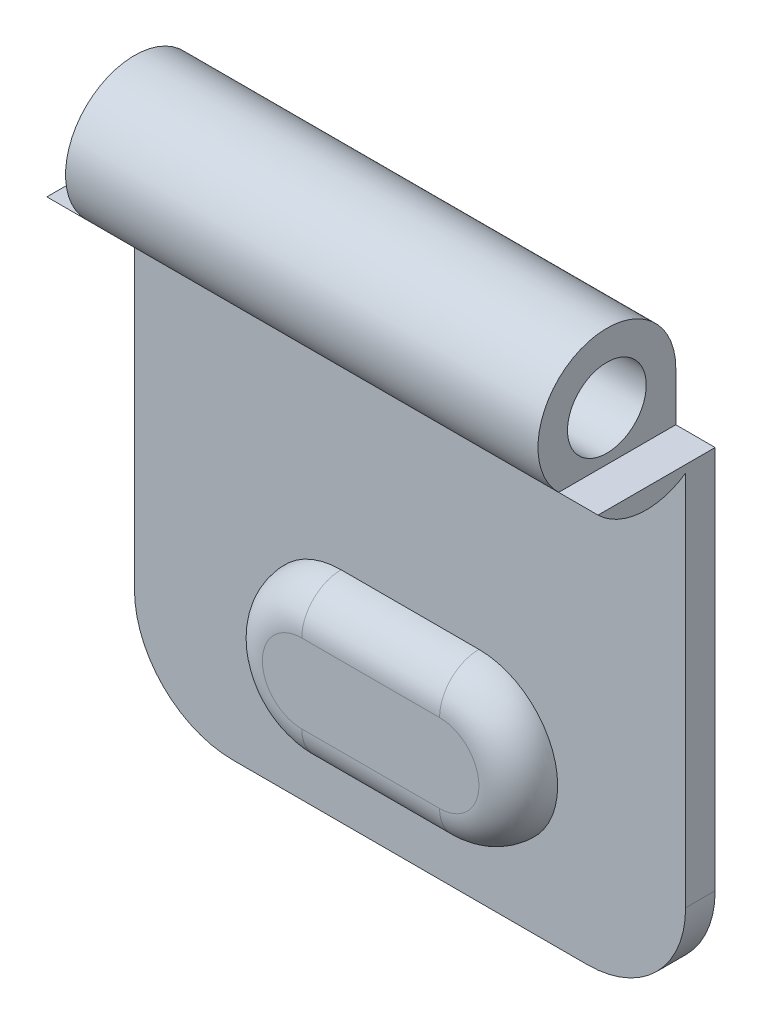
ISO-10303-21;
HEADER;
FILE_DESCRIPTION(('STEP AP214'),'2;1');
FILE_NAME('part.step','',(''),(''),'','','');
FILE_SCHEMA(('AUTOMOTIVE_DESIGN { 1 0 10303 214 1 1 1 1 }'));
ENDSEC;
DATA;
#1=APPLICATION_CONTEXT('core data for automotive mechanical design processes');
#2=APPLICATION_PROTOCOL_DEFINITION('international standard','automotive_design',2000,#1);
#3=PRODUCT_CONTEXT('',#1,'mechanical');
#4=PRODUCT('Part','Part','',(#3));
#5=PRODUCT_RELATED_PRODUCT_CATEGORY('part','',(#4));
#6=PRODUCT_DEFINITION_FORMATION('','',#4);
#7=PRODUCT_DEFINITION_CONTEXT('part definition',#1,'design');
#8=PRODUCT_DEFINITION('design','',#6,#7);
#9=PRODUCT_DEFINITION_SHAPE('','',#8);
#10=(LENGTH_UNIT() NAMED_UNIT(*) SI_UNIT(.MILLI.,.METRE.));
#11=(NAMED_UNIT(*) PLANE_ANGLE_UNIT() SI_UNIT($,.RADIAN.));
#12=(NAMED_UNIT(*) SI_UNIT($,.STERADIAN.) SOLID_ANGLE_UNIT());
#13=UNCERTAINTY_MEASURE_WITH_UNIT(LENGTH_MEASURE(1.E-05),#10,'distance_accuracy_value','');
#14=(GEOMETRIC_REPRESENTATION_CONTEXT(3) GLOBAL_UNCERTAINTY_ASSIGNED_CONTEXT((#13)) GLOBAL_UNIT_ASSIGNED_CONTEXT((#10,
#11,#12)) REPRESENTATION_CONTEXT('',''));
#15=CARTESIAN_POINT('',(0.,0.,0.));
#16=DIRECTION('',(0.,0.,1.));
#17=DIRECTION('',(1.,0.,0.));
#18=AXIS2_PLACEMENT_3D('',#15,#16,#17);
#19=CARTESIAN_POINT('',(-14.,-2.87228132326901,-2.));
#20=DIRECTION('',(0.,0.,1.));
#21=DIRECTION('',(0.,-1.,0.));
#22=AXIS2_PLACEMENT_3D('',#19,#20,#21);
#23=PLANE('',#22);
#24=DIRECTION('',(0.,-1.,0.));
#25=VECTOR('',#24,1.);
#26=CARTESIAN_POINT('',(-14.,-2.87228132326901,-2.));
#27=LINE('',#26,#25);
#28=CARTESIAN_POINT('',(-14.,-2.87228132326901,-2.));
#29=VERTEX_POINT('',#28);
#30=CARTESIAN_POINT('',(-14.,-22.,-2.));
#31=VERTEX_POINT('',#30);
#32=EDGE_CURVE('E235',#29,#31,#27,.T.);
#33=ORIENTED_EDGE('',*,*,#32,.T.);
#34=CARTESIAN_POINT('',(-9.,-22.,-2.));
#35=DIRECTION('',(0.,0.,1.));
#36=DIRECTION('',(0.,-1.,0.));
#37=AXIS2_PLACEMENT_3D('',#34,#35,#36);
#38=CIRCLE('',#37,5.);
#39=CARTESIAN_POINT('',(-9.,-27.,-2.));
#40=VERTEX_POINT('',#39);
#41=EDGE_CURVE('E263',#31,#40,#38,.T.);
#42=ORIENTED_EDGE('',*,*,#41,.T.);
#43=DIRECTION('',(1.,0.,0.));
#44=VECTOR('',#43,1.);
#45=CARTESIAN_POINT('',(-14.,-27.,-2.));
#46=LINE('',#45,#44);
#47=CARTESIAN_POINT('',(9.,-27.,-2.));
#48=VERTEX_POINT('',#47);
#49=EDGE_CURVE('E246',#40,#48,#46,.T.);
#50=ORIENTED_EDGE('',*,*,#49,.T.);
#51=CARTESIAN_POINT('',(9.,-22.,-2.));
#52=DIRECTION('',(0.,0.,1.));
#53=DIRECTION('',(0.,-1.,0.));
#54=AXIS2_PLACEMENT_3D('',#51,#52,#53);
#55=CIRCLE('',#54,5.);
#56=CARTESIAN_POINT('',(14.,-22.,-2.));
#57=VERTEX_POINT('',#56);
#58=EDGE_CURVE('E261',#48,#57,#55,.T.);
#59=ORIENTED_EDGE('',*,*,#58,.T.);
#60=DIRECTION('',(0.,-1.,0.));
#61=VECTOR('',#60,1.);
#62=CARTESIAN_POINT('',(14.,-2.87228132326901,-2.));
#63=LINE('',#62,#61);
#64=CARTESIAN_POINT('',(14.,-2.87228132326901,-2.));
#65=VERTEX_POINT('',#64);
#66=EDGE_CURVE('E227',#65,#57,#63,.T.);
#67=ORIENTED_EDGE('',*,*,#66,.F.);
#68=DIRECTION('',(1.,0.,0.));
#69=VECTOR('',#68,1.);
#70=CARTESIAN_POINT('',(-14.,-2.87228132326901,-2.));
#71=LINE('',#70,#69);
#72=EDGE_CURVE('E239',#29,#65,#71,.T.);
#73=ORIENTED_EDGE('',*,*,#72,.F.);
#74=EDGE_LOOP('',(#33,#42,#50,#59,#67,#73));
#75=FACE_BOUND('',#74,.T.);
#76=DIRECTION('',(1.,0.,0.));
#77=VECTOR('',#76,1.);
#78=CARTESIAN_POINT('',(-3.5,-23.881230086898,-2.));
#79=LINE('',#78,#77);
#80=CARTESIAN_POINT('',(-3.5,-23.881230086898,-2.));
#81=VERTEX_POINT('',#80);
#82=CARTESIAN_POINT('',(3.5,-23.881230086898,-2.));
#83=VERTEX_POINT('',#82);
#84=EDGE_CURVE('E215',#81,#83,#79,.T.);
#85=ORIENTED_EDGE('',*,*,#84,.F.);
#86=CARTESIAN_POINT('',(-3.5,-19.881230086898,-2.));
#87=DIRECTION('',(0.,0.,1.));
#88=DIRECTION('',(1.,0.,0.));
#89=AXIS2_PLACEMENT_3D('',#86,#87,#88);
#90=CIRCLE('',#89,4.);
#91=CARTESIAN_POINT('',(-3.5,-15.881230086898,-2.));
#92=VERTEX_POINT('',#91);
#93=EDGE_CURVE('E212',#92,#81,#90,.T.);
#94=ORIENTED_EDGE('',*,*,#93,.F.);
#95=DIRECTION('',(-1.,0.,0.));
#96=VECTOR('',#95,1.);
#97=CARTESIAN_POINT('',(-3.5,-15.881230086898,-2.));
#98=LINE('',#97,#96);
#99=CARTESIAN_POINT('',(3.5,-15.881230086898,-2.));
#100=VERTEX_POINT('',#99);
#101=EDGE_CURVE('E222',#100,#92,#98,.T.);
#102=ORIENTED_EDGE('',*,*,#101,.F.);
#103=CARTESIAN_POINT('',(3.5,-19.881230086898,-2.));
#104=DIRECTION('',(0.,0.,1.));
#105=DIRECTION('',(1.,0.,0.));
#106=AXIS2_PLACEMENT_3D('',#103,#104,#105);
#107=CIRCLE('',#106,4.);
#108=EDGE_CURVE('E219',#83,#100,#107,.T.);
#109=ORIENTED_EDGE('',*,*,#108,.F.);
#110=EDGE_LOOP('',(#85,#94,#102,#109));
#111=FACE_BOUND('',#110,.T.);
#112=ADVANCED_FACE('F35',(#75,#111),#23,.T.);
#113=CARTESIAN_POINT('',(-14.,0.,0.));
#114=DIRECTION('',(1.,0.,0.));
#115=DIRECTION('',(0.,0.,-1.));
#116=AXIS2_PLACEMENT_3D('',#113,#114,#115);
#117=CYLINDRICAL_SURFACE('',#116,3.5);
#118=DIRECTION('',(1.,0.,0.));
#119=VECTOR('',#118,1.);
#120=CARTESIAN_POINT('',(-14.,-2.5,2.44948974278318));
#121=LINE('',#120,#119);
#122=CARTESIAN_POINT('',(-14.,-2.5,2.44948974278318));
#123=VERTEX_POINT('',#122);
#124=CARTESIAN_POINT('',(-12.,-2.5,2.44948974278318));
#125=VERTEX_POINT('',#124);
#126=EDGE_CURVE('E176',#123,#125,#121,.T.);
#127=ORIENTED_EDGE('',*,*,#126,.F.);
#128=CARTESIAN_POINT('',(-14.,0.,0.));
#129=DIRECTION('',(1.,0.,0.));
#130=DIRECTION('',(0.,0.,-1.));
#131=AXIS2_PLACEMENT_3D('',#128,#129,#130);
#132=CIRCLE('',#131,3.5);
#133=EDGE_CURVE('E233',#123,#29,#132,.T.);
#134=ORIENTED_EDGE('',*,*,#133,.T.);
#135=ORIENTED_EDGE('',*,*,#72,.T.);
#136=CARTESIAN_POINT('',(14.,0.,0.));
#137=DIRECTION('',(1.,0.,0.));
#138=DIRECTION('',(0.,0.,-1.));
#139=AXIS2_PLACEMENT_3D('',#136,#137,#138);
#140=CIRCLE('',#139,3.5);
#141=CARTESIAN_POINT('',(14.,-2.5,2.44948974278318));
#142=VERTEX_POINT('',#141);
#143=EDGE_CURVE('E225',#142,#65,#140,.T.);
#144=ORIENTED_EDGE('',*,*,#143,.F.);
#145=DIRECTION('',(1.,0.,0.));
#146=VECTOR('',#145,1.);
#147=CARTESIAN_POINT('',(-14.,-2.5,2.44948974278318));
#148=LINE('',#147,#146);
#149=CARTESIAN_POINT('',(12.,-2.5,2.44948974278318));
#150=VERTEX_POINT('',#149);
#151=EDGE_CURVE('E59',#150,#142,#148,.T.);
#152=ORIENTED_EDGE('',*,*,#151,.F.);
#153=CARTESIAN_POINT('',(12.,0.,0.));
#154=DIRECTION('',(-1.,0.,0.));
#155=DIRECTION('',(0.,0.,1.));
#156=AXIS2_PLACEMENT_3D('',#153,#154,#155);
#157=CIRCLE('',#156,3.5);
#158=CARTESIAN_POINT('',(12.,0.,-3.5));
#159=VERTEX_POINT('',#158);
#160=EDGE_CURVE('E209',#159,#150,#157,.F.);
#161=ORIENTED_EDGE('',*,*,#160,.F.);
#162=DIRECTION('',(1.,0.,0.));
#163=VECTOR('',#162,1.);
#164=CARTESIAN_POINT('',(-14.,0.,-3.5));
#165=LINE('',#164,#163);
#166=CARTESIAN_POINT('',(-12.,0.,-3.5));
#167=VERTEX_POINT('',#166);
#168=EDGE_CURVE('E240',#167,#159,#165,.T.);
#169=ORIENTED_EDGE('',*,*,#168,.F.);
#170=CARTESIAN_POINT('',(-12.,0.,0.));
#171=DIRECTION('',(1.,0.,0.));
#172=DIRECTION('',(0.,0.,-1.));
#173=AXIS2_PLACEMENT_3D('',#170,#171,#172);
#174=CIRCLE('',#173,3.5);
#175=EDGE_CURVE('E185',#125,#167,#174,.F.);
#176=ORIENTED_EDGE('',*,*,#175,.F.);
#177=EDGE_LOOP('',(#127,#134,#135,#144,#152,#161,#169,#176));
#178=FACE_BOUND('',#177,.T.);
#179=ADVANCED_FACE('F352',(#178),#117,.T.);
#180=CARTESIAN_POINT('',(-14.,0.,-3.5));
#181=DIRECTION('',(0.,0.,-1.));
#182=DIRECTION('',(0.,1.,0.));
#183=AXIS2_PLACEMENT_3D('',#180,#181,#182);
#184=PLANE('',#183);
#185=DIRECTION('',(-1.,0.,0.));
#186=VECTOR('',#185,1.);
#187=CARTESIAN_POINT('',(-14.,-2.5,-3.5));
#188=LINE('',#187,#186);
#189=CARTESIAN_POINT('',(-12.,-2.5,-3.5));
#190=VERTEX_POINT('',#189);
#191=CARTESIAN_POINT('',(-14.,-2.5,-3.5));
#192=VERTEX_POINT('',#191);
#193=EDGE_CURVE('E52',#190,#192,#188,.T.);
#194=ORIENTED_EDGE('',*,*,#193,.F.);
#195=DIRECTION('',(0.,-1.,0.));
#196=VECTOR('',#195,1.);
#197=CARTESIAN_POINT('',(-12.,3.5,-3.5));
#198=LINE('',#197,#196);
#199=EDGE_CURVE('E182',#167,#190,#198,.T.);
#200=ORIENTED_EDGE('',*,*,#199,.F.);
#201=ORIENTED_EDGE('',*,*,#168,.T.);
#202=DIRECTION('',(0.,1.,0.));
#203=VECTOR('',#202,1.);
#204=CARTESIAN_POINT('',(12.,3.5,-3.5));
#205=LINE('',#204,#203);
#206=CARTESIAN_POINT('',(12.,-2.5,-3.5));
#207=VERTEX_POINT('',#206);
#208=EDGE_CURVE('E202',#207,#159,#205,.T.);
#209=ORIENTED_EDGE('',*,*,#208,.F.);
#210=DIRECTION('',(-1.,0.,0.));
#211=VECTOR('',#210,1.);
#212=CARTESIAN_POINT('',(14.,-2.5,-3.5));
#213=LINE('',#212,#211);
#214=CARTESIAN_POINT('',(14.,-2.5,-3.5));
#215=VERTEX_POINT('',#214);
#216=EDGE_CURVE('E199',#215,#207,#213,.T.);
#217=ORIENTED_EDGE('',*,*,#216,.F.);
#218=DIRECTION('',(0.,1.,0.));
#219=VECTOR('',#218,1.);
#220=CARTESIAN_POINT('',(14.,0.,-3.5));
#221=LINE('',#220,#219);
#222=CARTESIAN_POINT('',(14.,-22.,-3.5));
#223=VERTEX_POINT('',#222);
#224=EDGE_CURVE('E230',#223,#215,#221,.T.);
#225=ORIENTED_EDGE('',*,*,#224,.F.);
#226=CARTESIAN_POINT('',(9.,-22.,-3.5));
#227=DIRECTION('',(0.,0.,-1.));
#228=DIRECTION('',(0.,1.,0.));
#229=AXIS2_PLACEMENT_3D('',#226,#227,#228);
#230=CIRCLE('',#229,5.);
#231=CARTESIAN_POINT('',(9.,-27.,-3.5));
#232=VERTEX_POINT('',#231);
#233=EDGE_CURVE('E255',#223,#232,#230,.T.);
#234=ORIENTED_EDGE('',*,*,#233,.T.);
#235=DIRECTION('',(1.,0.,0.));
#236=VECTOR('',#235,1.);
#237=CARTESIAN_POINT('',(-14.,-27.,-3.5));
#238=LINE('',#237,#236);
#239=CARTESIAN_POINT('',(-9.,-27.,-3.5));
#240=VERTEX_POINT('',#239);
#241=EDGE_CURVE('E243',#240,#232,#238,.T.);
#242=ORIENTED_EDGE('',*,*,#241,.F.);
#243=CARTESIAN_POINT('',(-9.,-22.,-3.5));
#244=DIRECTION('',(0.,0.,-1.));
#245=DIRECTION('',(0.,1.,0.));
#246=AXIS2_PLACEMENT_3D('',#243,#244,#245);
#247=CIRCLE('',#246,5.);
#248=CARTESIAN_POINT('',(-14.,-22.,-3.5));
#249=VERTEX_POINT('',#248);
#250=EDGE_CURVE('E257',#240,#249,#247,.T.);
#251=ORIENTED_EDGE('',*,*,#250,.T.);
#252=DIRECTION('',(0.,1.,0.));
#253=VECTOR('',#252,1.);
#254=CARTESIAN_POINT('',(-14.,0.,-3.5));
#255=LINE('',#254,#253);
#256=EDGE_CURVE('E193',#249,#192,#255,.T.);
#257=ORIENTED_EDGE('',*,*,#256,.T.);
#258=EDGE_LOOP('',(#194,#200,#201,#209,#217,#225,#234,#242,#251,#257));
#259=FACE_BOUND('',#258,.T.);
#260=DIRECTION('',(-1.,0.,0.));
#261=VECTOR('',#260,1.);
#262=CARTESIAN_POINT('',(-4.,-15.9735953473637,-3.5));
#263=LINE('',#262,#261);
#264=CARTESIAN_POINT('',(4.,-15.9735953473637,-3.5));
#265=VERTEX_POINT('',#264);
#266=CARTESIAN_POINT('',(-4.,-15.9735953473637,-3.5));
#267=VERTEX_POINT('',#266);
#268=EDGE_CURVE('E310',#265,#267,#263,.T.);
#269=ORIENTED_EDGE('',*,*,#268,.T.);
#270=CARTESIAN_POINT('',(-4.,-19.9376969625014,-3.5));
#271=DIRECTION('',(0.,0.,-1.));
#272=DIRECTION('',(0.,1.,0.));
#273=AXIS2_PLACEMENT_3D('',#270,#271,#272);
#274=CIRCLE('',#273,3.96410161513775);
#275=CARTESIAN_POINT('',(-4.,-23.9017985776392,-3.5));
#276=VERTEX_POINT('',#275);
#277=EDGE_CURVE('E316',#267,#276,#274,.F.);
#278=ORIENTED_EDGE('',*,*,#277,.T.);
#279=DIRECTION('',(1.,0.,0.));
#280=VECTOR('',#279,1.);
#281=CARTESIAN_POINT('',(4.,-23.9017985776392,-3.5));
#282=LINE('',#281,#280);
#283=CARTESIAN_POINT('',(4.,-23.9017985776392,-3.5));
#284=VERTEX_POINT('',#283);
#285=EDGE_CURVE('E314',#276,#284,#282,.T.);
#286=ORIENTED_EDGE('',*,*,#285,.T.);
#287=CARTESIAN_POINT('',(4.,-19.9376969625014,-3.5));
#288=DIRECTION('',(0.,0.,-1.));
#289=DIRECTION('',(0.,1.,0.));
#290=AXIS2_PLACEMENT_3D('',#287,#288,#289);
#291=CIRCLE('',#290,3.96410161513775);
#292=EDGE_CURVE('E312',#284,#265,#291,.F.);
#293=ORIENTED_EDGE('',*,*,#292,.T.);
#294=EDGE_LOOP('',(#269,#278,#286,#293));
#295=FACE_BOUND('',#294,.T.);
#296=ADVANCED_FACE('F190',(#259,#295),#184,.T.);
#297=CARTESIAN_POINT('',(-14.,-27.,-3.5));
#298=DIRECTION('',(0.,-1.,0.));
#299=DIRECTION('',(0.,0.,-1.));
#300=AXIS2_PLACEMENT_3D('',#297,#298,#299);
#301=PLANE('',#300);
#302=ORIENTED_EDGE('',*,*,#49,.F.);
#303=DIRECTION('',(0.,0.,-1.));
#304=VECTOR('',#303,1.);
#305=CARTESIAN_POINT('',(-9.,-27.,-3.5));
#306=LINE('',#305,#304);
#307=EDGE_CURVE('E252',#40,#240,#306,.T.);
#308=ORIENTED_EDGE('',*,*,#307,.T.);
#309=ORIENTED_EDGE('',*,*,#241,.T.);
#310=DIRECTION('',(0.,0.,-1.));
#311=VECTOR('',#310,1.);
#312=CARTESIAN_POINT('',(9.,-27.,-3.5));
#313=LINE('',#312,#311);
#314=EDGE_CURVE('E242',#232,#48,#313,.F.);
#315=ORIENTED_EDGE('',*,*,#314,.T.);
#316=EDGE_LOOP('',(#302,#308,#309,#315));
#317=FACE_BOUND('',#316,.T.);
#318=ADVANCED_FACE('F363',(#317),#301,.T.);
#319=CARTESIAN_POINT('',(-14.,0.,0.));
#320=DIRECTION('',(1.,0.,0.));
#321=DIRECTION('',(0.,0.,-1.));
#322=AXIS2_PLACEMENT_3D('',#319,#320,#321);
#323=PLANE('',#322);
#324=ORIENTED_EDGE('',*,*,#133,.F.);
#325=DIRECTION('',(0.,0.,-1.));
#326=VECTOR('',#325,1.);
#327=CARTESIAN_POINT('',(-14.,-2.5,3.5));
#328=LINE('',#327,#326);
#329=EDGE_CURVE('E179',#123,#192,#328,.T.);
#330=ORIENTED_EDGE('',*,*,#329,.T.);
#331=ORIENTED_EDGE('',*,*,#256,.F.);
#332=DIRECTION('',(0.,0.,-1.));
#333=VECTOR('',#332,1.);
#334=CARTESIAN_POINT('',(-14.,-22.,-2.));
#335=LINE('',#334,#333);
#336=EDGE_CURVE('E259',#249,#31,#335,.F.);
#337=ORIENTED_EDGE('',*,*,#336,.T.);
#338=ORIENTED_EDGE('',*,*,#32,.F.);
#339=EDGE_LOOP('',(#324,#330,#331,#337,#338));
#340=FACE_BOUND('',#339,.T.);
#341=ADVANCED_FACE('F452',(#340),#323,.F.);
#342=CARTESIAN_POINT('',(-14.,0.,0.));
#343=DIRECTION('',(1.,0.,0.));
#344=DIRECTION('',(0.,0.,-1.));
#345=AXIS2_PLACEMENT_3D('',#342,#343,#344);
#346=CYLINDRICAL_SURFACE('',#345,2.);
#347=CARTESIAN_POINT('',(-12.,0.,0.));
#348=DIRECTION('',(1.,0.,0.));
#349=DIRECTION('',(0.,0.,-1.));
#350=AXIS2_PLACEMENT_3D('',#347,#348,#349);
#351=CIRCLE('',#350,2.);
#352=CARTESIAN_POINT('',(-12.,0.,-2.));
#353=VERTEX_POINT('',#352);
#354=EDGE_CURVE('E39',#353,#353,#351,.F.);
#355=ORIENTED_EDGE('',*,*,#354,.T.);
#356=EDGE_LOOP('',(#355));
#357=FACE_BOUND('',#356,.T.);
#358=CARTESIAN_POINT('',(12.,0.,0.));
#359=DIRECTION('',(-1.,0.,0.));
#360=DIRECTION('',(0.,0.,1.));
#361=AXIS2_PLACEMENT_3D('',#358,#359,#360);
#362=CIRCLE('',#361,2.);
#363=CARTESIAN_POINT('',(12.,0.,2.));
#364=VERTEX_POINT('',#363);
#365=EDGE_CURVE('E208',#364,#364,#362,.F.);
#366=ORIENTED_EDGE('',*,*,#365,.T.);
#367=EDGE_LOOP('',(#366));
#368=FACE_BOUND('',#367,.T.);
#369=ADVANCED_FACE('F334',(#357,#368),#346,.F.);
#370=CARTESIAN_POINT('',(14.,0.,0.));
#371=DIRECTION('',(1.,0.,0.));
#372=DIRECTION('',(0.,0.,-1.));
#373=AXIS2_PLACEMENT_3D('',#370,#371,#372);
#374=PLANE('',#373);
#375=DIRECTION('',(0.,0.,-1.));
#376=VECTOR('',#375,1.);
#377=CARTESIAN_POINT('',(14.,-2.5,0.));
#378=LINE('',#377,#376);
#379=EDGE_CURVE('E11',#142,#215,#378,.T.);
#380=ORIENTED_EDGE('',*,*,#379,.F.);
#381=ORIENTED_EDGE('',*,*,#143,.T.);
#382=ORIENTED_EDGE('',*,*,#66,.T.);
#383=DIRECTION('',(0.,0.,-1.));
#384=VECTOR('',#383,1.);
#385=CARTESIAN_POINT('',(14.,-22.,0.));
#386=LINE('',#385,#384);
#387=EDGE_CURVE('E265',#57,#223,#386,.T.);
#388=ORIENTED_EDGE('',*,*,#387,.T.);
#389=ORIENTED_EDGE('',*,*,#224,.T.);
#390=EDGE_LOOP('',(#380,#381,#382,#388,#389));
#391=FACE_BOUND('',#390,.T.);
#392=ADVANCED_FACE('F370',(#391),#374,.T.);
#393=CARTESIAN_POINT('',(-9.,-22.,-3.5));
#394=DIRECTION('',(0.,0.,1.));
#395=DIRECTION('',(1.,0.,0.));
#396=AXIS2_PLACEMENT_3D('',#393,#394,#395);
#397=CYLINDRICAL_SURFACE('',#396,5.);
#398=ORIENTED_EDGE('',*,*,#41,.F.);
#399=ORIENTED_EDGE('',*,*,#336,.F.);
#400=ORIENTED_EDGE('',*,*,#250,.F.);
#401=ORIENTED_EDGE('',*,*,#307,.F.);
#402=EDGE_LOOP('',(#398,#399,#400,#401));
#403=FACE_BOUND('',#402,.T.);
#404=ADVANCED_FACE('F366',(#403),#397,.T.);
#405=CARTESIAN_POINT('',(9.,-22.,0.));
#406=DIRECTION('',(0.,0.,-1.));
#407=DIRECTION('',(-1.,0.,0.));
#408=AXIS2_PLACEMENT_3D('',#405,#406,#407);
#409=CYLINDRICAL_SURFACE('',#408,5.);
#410=ORIENTED_EDGE('',*,*,#58,.F.);
#411=ORIENTED_EDGE('',*,*,#314,.F.);
#412=ORIENTED_EDGE('',*,*,#233,.F.);
#413=ORIENTED_EDGE('',*,*,#387,.F.);
#414=EDGE_LOOP('',(#410,#411,#412,#413));
#415=FACE_BOUND('',#414,.T.);
#416=ADVANCED_FACE('F369',(#415),#409,.T.);
#417=CARTESIAN_POINT('',(-3.5,-19.881230086898,0.));
#418=DIRECTION('',(0.,0.,1.));
#419=DIRECTION('',(1.,0.,0.));
#420=AXIS2_PLACEMENT_3D('',#417,#418,#419);
#421=PLANE('',#420);
#422=DIRECTION('',(-1.,0.,0.));
#423=VECTOR('',#422,1.);
#424=CARTESIAN_POINT('',(-3.5,-17.881230086898,0.));
#425=LINE('',#424,#423);
#426=CARTESIAN_POINT('',(3.5,-17.881230086898,0.));
#427=VERTEX_POINT('',#426);
#428=CARTESIAN_POINT('',(-3.5,-17.881230086898,0.));
#429=VERTEX_POINT('',#428);
#430=EDGE_CURVE('E272',#427,#429,#425,.T.);
#431=ORIENTED_EDGE('',*,*,#430,.T.);
#432=CARTESIAN_POINT('',(-3.5,-19.881230086898,0.));
#433=DIRECTION('',(0.,0.,1.));
#434=DIRECTION('',(1.,0.,0.));
#435=AXIS2_PLACEMENT_3D('',#432,#433,#434);
#436=CIRCLE('',#435,2.);
#437=CARTESIAN_POINT('',(-3.5,-21.881230086898,0.));
#438=VERTEX_POINT('',#437);
#439=EDGE_CURVE('E274',#429,#438,#436,.T.);
#440=ORIENTED_EDGE('',*,*,#439,.T.);
#441=DIRECTION('',(1.,0.,0.));
#442=VECTOR('',#441,1.);
#443=CARTESIAN_POINT('',(3.5,-21.881230086898,0.));
#444=LINE('',#443,#442);
#445=CARTESIAN_POINT('',(3.5,-21.881230086898,0.));
#446=VERTEX_POINT('',#445);
#447=EDGE_CURVE('E268',#438,#446,#444,.T.);
#448=ORIENTED_EDGE('',*,*,#447,.T.);
#449=CARTESIAN_POINT('',(3.5,-19.881230086898,0.));
#450=DIRECTION('',(0.,0.,1.));
#451=DIRECTION('',(1.,0.,0.));
#452=AXIS2_PLACEMENT_3D('',#449,#450,#451);
#453=CIRCLE('',#452,2.);
#454=EDGE_CURVE('E270',#446,#427,#453,.T.);
#455=ORIENTED_EDGE('',*,*,#454,.T.);
#456=EDGE_LOOP('',(#431,#440,#448,#455));
#457=FACE_BOUND('',#456,.T.);
#458=ADVANCED_FACE('F374',(#457),#421,.T.);
#459=CARTESIAN_POINT('',(3.5,-19.881230086898,-2.));
#460=DIRECTION('',(0.,0.,1.));
#461=DIRECTION('',(1.,0.,0.));
#462=AXIS2_PLACEMENT_3D('',#459,#460,#461);
#463=DEGENERATE_TOROIDAL_SURFACE('',#462,2.,2.,.T.);
#464=CARTESIAN_POINT('',(3.5,-21.881230086898,-2.));
#465=DIRECTION('',(-1.,0.,0.));
#466=DIRECTION('',(0.,-1.,0.));
#467=AXIS2_PLACEMENT_3D('',#464,#465,#466);
#468=CIRCLE('',#467,2.);
#469=EDGE_CURVE('E283',#83,#446,#468,.T.);
#470=ORIENTED_EDGE('',*,*,#469,.F.);
#471=ORIENTED_EDGE('',*,*,#108,.T.);
#472=CARTESIAN_POINT('',(3.5,-17.881230086898,-2.));
#473=DIRECTION('',(-1.,0.,0.));
#474=DIRECTION('',(0.,0.,1.));
#475=AXIS2_PLACEMENT_3D('',#472,#473,#474);
#476=CIRCLE('',#475,2.);
#477=EDGE_CURVE('E216',#427,#100,#476,.T.);
#478=ORIENTED_EDGE('',*,*,#477,.F.);
#479=ORIENTED_EDGE('',*,*,#454,.F.);
#480=EDGE_LOOP('',(#470,#471,#478,#479));
#481=FACE_BOUND('',#480,.T.);
#482=ADVANCED_FACE('F388',(#481),#463,.T.);
#483=CARTESIAN_POINT('',(-3.5,-17.881230086898,-2.));
#484=DIRECTION('',(1.,0.,0.));
#485=DIRECTION('',(0.,0.,-1.));
#486=AXIS2_PLACEMENT_3D('',#483,#484,#485);
#487=CYLINDRICAL_SURFACE('',#486,2.);
#488=ORIENTED_EDGE('',*,*,#477,.T.);
#489=ORIENTED_EDGE('',*,*,#101,.T.);
#490=CARTESIAN_POINT('',(-3.5,-17.881230086898,-2.));
#491=DIRECTION('',(-1.,0.,0.));
#492=DIRECTION('',(0.,0.,1.));
#493=AXIS2_PLACEMENT_3D('',#490,#491,#492);
#494=CIRCLE('',#493,2.);
#495=EDGE_CURVE('E280',#429,#92,#494,.T.);
#496=ORIENTED_EDGE('',*,*,#495,.F.);
#497=ORIENTED_EDGE('',*,*,#430,.F.);
#498=EDGE_LOOP('',(#488,#489,#496,#497));
#499=FACE_BOUND('',#498,.T.);
#500=ADVANCED_FACE('F384',(#499),#487,.T.);
#501=CARTESIAN_POINT('',(-3.5,-21.881230086898,-2.));
#502=DIRECTION('',(-1.,0.,0.));
#503=DIRECTION('',(0.,0.,1.));
#504=AXIS2_PLACEMENT_3D('',#501,#502,#503);
#505=CYLINDRICAL_SURFACE('',#504,2.);
#506=ORIENTED_EDGE('',*,*,#469,.T.);
#507=ORIENTED_EDGE('',*,*,#447,.F.);
#508=CARTESIAN_POINT('',(-3.5,-21.881230086898,-2.));
#509=DIRECTION('',(-1.,0.,0.));
#510=DIRECTION('',(0.,0.,1.));
#511=AXIS2_PLACEMENT_3D('',#508,#509,#510);
#512=CIRCLE('',#511,2.);
#513=EDGE_CURVE('E278',#81,#438,#512,.T.);
#514=ORIENTED_EDGE('',*,*,#513,.F.);
#515=ORIENTED_EDGE('',*,*,#84,.T.);
#516=EDGE_LOOP('',(#506,#507,#514,#515));
#517=FACE_BOUND('',#516,.T.);
#518=ADVANCED_FACE('F380',(#517),#505,.T.);
#519=CARTESIAN_POINT('',(-3.5,-19.881230086898,-2.));
#520=DIRECTION('',(0.,0.,1.));
#521=DIRECTION('',(1.,0.,0.));
#522=AXIS2_PLACEMENT_3D('',#519,#520,#521);
#523=DEGENERATE_TOROIDAL_SURFACE('',#522,2.,2.,.T.);
#524=ORIENTED_EDGE('',*,*,#495,.T.);
#525=ORIENTED_EDGE('',*,*,#93,.T.);
#526=ORIENTED_EDGE('',*,*,#513,.T.);
#527=ORIENTED_EDGE('',*,*,#439,.F.);
#528=EDGE_LOOP('',(#524,#525,#526,#527));
#529=FACE_BOUND('',#528,.T.);
#530=ADVANCED_FACE('F376',(#529),#523,.T.);
#531=CARTESIAN_POINT('',(4.,-19.9376969625014,-1.5));
#532=DIRECTION('',(0.,0.,-1.));
#533=DIRECTION('',(0.,1.,0.));
#534=AXIS2_PLACEMENT_3D('',#531,#532,#533);
#535=PLANE('',#534);
#536=DIRECTION('',(-1.,0.,0.));
#537=VECTOR('',#536,1.);
#538=CARTESIAN_POINT('',(4.,-20.4376969625014,-1.5));
#539=LINE('',#538,#537);
#540=CARTESIAN_POINT('',(4.,-20.4376969625014,-1.5));
#541=VERTEX_POINT('',#540);
#542=CARTESIAN_POINT('',(-4.,-20.4376969625014,-1.5));
#543=VERTEX_POINT('',#542);
#544=EDGE_CURVE('E292',#541,#543,#539,.T.);
#545=ORIENTED_EDGE('',*,*,#544,.T.);
#546=CARTESIAN_POINT('',(-4.,-19.9376969625014,-1.5));
#547=DIRECTION('',(0.,0.,-1.));
#548=DIRECTION('',(0.,1.,0.));
#549=AXIS2_PLACEMENT_3D('',#546,#547,#548);
#550=CIRCLE('',#549,0.499999999999999);
#551=CARTESIAN_POINT('',(-4.,-19.4376969625014,-1.5));
#552=VERTEX_POINT('',#551);
#553=EDGE_CURVE('E294',#543,#552,#550,.T.);
#554=ORIENTED_EDGE('',*,*,#553,.T.);
#555=DIRECTION('',(1.,0.,0.));
#556=VECTOR('',#555,1.);
#557=CARTESIAN_POINT('',(4.,-19.4376969625014,-1.5));
#558=LINE('',#557,#556);
#559=CARTESIAN_POINT('',(4.,-19.4376969625014,-1.5));
#560=VERTEX_POINT('',#559);
#561=EDGE_CURVE('E277',#552,#560,#558,.T.);
#562=ORIENTED_EDGE('',*,*,#561,.T.);
#563=CARTESIAN_POINT('',(4.,-19.9376969625014,-1.5));
#564=DIRECTION('',(0.,0.,-1.));
#565=DIRECTION('',(0.,1.,0.));
#566=AXIS2_PLACEMENT_3D('',#563,#564,#565);
#567=CIRCLE('',#566,0.499999999999999);
#568=EDGE_CURVE('E290',#560,#541,#567,.T.);
#569=ORIENTED_EDGE('',*,*,#568,.T.);
#570=EDGE_LOOP('',(#545,#554,#562,#569));
#571=FACE_BOUND('',#570,.T.);
#572=ADVANCED_FACE('F379',(#571),#535,.T.);
#573=CARTESIAN_POINT('',(4.,-19.9376969625014,-3.5));
#574=DIRECTION('',(0.,0.,-1.));
#575=DIRECTION('',(0.,1.,0.));
#576=AXIS2_PLACEMENT_3D('',#573,#574,#575);
#577=DEGENERATE_TOROIDAL_SURFACE('',#576,0.499999999999999,2.,.T.);
#578=CARTESIAN_POINT('',(4.,-19.4376969625014,-3.5));
#579=DIRECTION('',(1.,0.,0.));
#580=DIRECTION('',(0.,0.,-1.));
#581=AXIS2_PLACEMENT_3D('',#578,#579,#580);
#582=CIRCLE('',#581,2.);
#583=CARTESIAN_POINT('',(4.,-17.7056461549325,-2.5));
#584=VERTEX_POINT('',#583);
#585=EDGE_CURVE('E304',#584,#560,#582,.T.);
#586=ORIENTED_EDGE('',*,*,#585,.F.);
#587=CARTESIAN_POINT('',(4.,-19.9376969625014,-2.5));
#588=DIRECTION('',(0.,0.,-1.));
#589=DIRECTION('',(0.,1.,0.));
#590=AXIS2_PLACEMENT_3D('',#587,#588,#589);
#591=CIRCLE('',#590,2.23205080756888);
#592=CARTESIAN_POINT('',(4.,-22.1697477700703,-2.5));
#593=VERTEX_POINT('',#592);
#594=EDGE_CURVE('E321',#584,#593,#591,.T.);
#595=ORIENTED_EDGE('',*,*,#594,.T.);
#596=CARTESIAN_POINT('',(4.,-20.4376969625014,-3.5));
#597=DIRECTION('',(1.,0.,0.));
#598=DIRECTION('',(0.,0.,-1.));
#599=AXIS2_PLACEMENT_3D('',#596,#597,#598);
#600=CIRCLE('',#599,2.);
#601=EDGE_CURVE('E281',#541,#593,#600,.T.);
#602=ORIENTED_EDGE('',*,*,#601,.F.);
#603=ORIENTED_EDGE('',*,*,#568,.F.);
#604=EDGE_LOOP('',(#586,#595,#602,#603));
#605=FACE_BOUND('',#604,.T.);
#606=ADVANCED_FACE('F404',(#605),#577,.F.);
#607=CARTESIAN_POINT('',(4.,-20.4376969625014,-3.5));
#608=DIRECTION('',(-1.,0.,0.));
#609=DIRECTION('',(0.,0.,1.));
#610=AXIS2_PLACEMENT_3D('',#607,#608,#609);
#611=CYLINDRICAL_SURFACE('',#610,2.);
#612=ORIENTED_EDGE('',*,*,#601,.T.);
#613=DIRECTION('',(-1.,0.,0.));
#614=VECTOR('',#613,1.);
#615=CARTESIAN_POINT('',(4.,-22.1697477700703,-2.5));
#616=LINE('',#615,#614);
#617=CARTESIAN_POINT('',(-4.,-22.1697477700703,-2.5));
#618=VERTEX_POINT('',#617);
#619=EDGE_CURVE('E319',#593,#618,#616,.T.);
#620=ORIENTED_EDGE('',*,*,#619,.T.);
#621=CARTESIAN_POINT('',(-4.,-20.4376969625014,-3.5));
#622=DIRECTION('',(1.,0.,0.));
#623=DIRECTION('',(0.,1.,0.));
#624=AXIS2_PLACEMENT_3D('',#621,#622,#623);
#625=CIRCLE('',#624,2.);
#626=EDGE_CURVE('E300',#543,#618,#625,.T.);
#627=ORIENTED_EDGE('',*,*,#626,.F.);
#628=ORIENTED_EDGE('',*,*,#544,.F.);
#629=EDGE_LOOP('',(#612,#620,#627,#628));
#630=FACE_BOUND('',#629,.T.);
#631=ADVANCED_FACE('F400',(#630),#611,.F.);
#632=CARTESIAN_POINT('',(4.,-19.4376969625014,-3.5));
#633=DIRECTION('',(1.,0.,0.));
#634=DIRECTION('',(0.,0.,-1.));
#635=AXIS2_PLACEMENT_3D('',#632,#633,#634);
#636=CYLINDRICAL_SURFACE('',#635,2.);
#637=CARTESIAN_POINT('',(-4.,-19.4376969625014,-3.5));
#638=DIRECTION('',(1.,0.,0.));
#639=DIRECTION('',(0.,0.,-1.));
#640=AXIS2_PLACEMENT_3D('',#637,#638,#639);
#641=CIRCLE('',#640,2.);
#642=CARTESIAN_POINT('',(-4.,-17.7056461549325,-2.5));
#643=VERTEX_POINT('',#642);
#644=EDGE_CURVE('E298',#643,#552,#641,.T.);
#645=ORIENTED_EDGE('',*,*,#644,.F.);
#646=DIRECTION('',(1.,0.,0.));
#647=VECTOR('',#646,1.);
#648=CARTESIAN_POINT('',(4.,-17.7056461549325,-2.5));
#649=LINE('',#648,#647);
#650=EDGE_CURVE('E44',#643,#584,#649,.T.);
#651=ORIENTED_EDGE('',*,*,#650,.T.);
#652=ORIENTED_EDGE('',*,*,#585,.T.);
#653=ORIENTED_EDGE('',*,*,#561,.F.);
#654=EDGE_LOOP('',(#645,#651,#652,#653));
#655=FACE_BOUND('',#654,.T.);
#656=ADVANCED_FACE('F396',(#655),#636,.F.);
#657=CARTESIAN_POINT('',(-4.,-19.9376969625014,-3.5));
#658=DIRECTION('',(0.,0.,-1.));
#659=DIRECTION('',(0.,1.,0.));
#660=AXIS2_PLACEMENT_3D('',#657,#658,#659);
#661=DEGENERATE_TOROIDAL_SURFACE('',#660,0.499999999999999,2.,.T.);
#662=ORIENTED_EDGE('',*,*,#626,.T.);
#663=CARTESIAN_POINT('',(-4.,-19.9376969625014,-2.5));
#664=DIRECTION('',(0.,0.,-1.));
#665=DIRECTION('',(0.,1.,0.));
#666=AXIS2_PLACEMENT_3D('',#663,#664,#665);
#667=CIRCLE('',#666,2.23205080756888);
#668=EDGE_CURVE('E297',#618,#643,#667,.T.);
#669=ORIENTED_EDGE('',*,*,#668,.T.);
#670=ORIENTED_EDGE('',*,*,#644,.T.);
#671=ORIENTED_EDGE('',*,*,#553,.F.);
#672=EDGE_LOOP('',(#662,#669,#670,#671));
#673=FACE_BOUND('',#672,.T.);
#674=ADVANCED_FACE('F393',(#673),#661,.F.);
#675=CARTESIAN_POINT('',(4.,-19.9376969625014,-1.5));
#676=DIRECTION('',(0.,0.,-1.));
#677=DIRECTION('',(0.,1.,0.));
#678=AXIS2_PLACEMENT_3D('',#675,#676,#677);
#679=TOROIDAL_SURFACE('',#678,3.96410161513775,2.);
#680=CARTESIAN_POINT('',(4.,-15.9735953473637,-1.5));
#681=DIRECTION('',(-1.,0.,0.));
#682=DIRECTION('',(0.,0.,1.));
#683=AXIS2_PLACEMENT_3D('',#680,#681,#682);
#684=CIRCLE('',#683,2.);
#685=EDGE_CURVE('E327',#265,#584,#684,.T.);
#686=ORIENTED_EDGE('',*,*,#685,.F.);
#687=ORIENTED_EDGE('',*,*,#292,.F.);
#688=CARTESIAN_POINT('',(4.,-23.9017985776392,-1.5));
#689=DIRECTION('',(-1.,0.,0.));
#690=DIRECTION('',(0.,0.,1.));
#691=AXIS2_PLACEMENT_3D('',#688,#689,#690);
#692=CIRCLE('',#691,2.);
#693=EDGE_CURVE('E301',#593,#284,#692,.T.);
#694=ORIENTED_EDGE('',*,*,#693,.F.);
#695=ORIENTED_EDGE('',*,*,#594,.F.);
#696=EDGE_LOOP('',(#686,#687,#694,#695));
#697=FACE_BOUND('',#696,.T.);
#698=ADVANCED_FACE('F37',(#697),#679,.T.);
#699=CARTESIAN_POINT('',(4.,-23.9017985776392,-1.5));
#700=DIRECTION('',(-1.,0.,0.));
#701=DIRECTION('',(0.,0.,1.));
#702=AXIS2_PLACEMENT_3D('',#699,#700,#701);
#703=CYLINDRICAL_SURFACE('',#702,2.);
#704=ORIENTED_EDGE('',*,*,#693,.T.);
#705=ORIENTED_EDGE('',*,*,#285,.F.);
#706=CARTESIAN_POINT('',(-4.,-23.9017985776392,-1.5));
#707=DIRECTION('',(-1.,0.,0.));
#708=DIRECTION('',(0.,0.,1.));
#709=AXIS2_PLACEMENT_3D('',#706,#707,#708);
#710=CIRCLE('',#709,2.);
#711=EDGE_CURVE('E325',#618,#276,#710,.T.);
#712=ORIENTED_EDGE('',*,*,#711,.F.);
#713=ORIENTED_EDGE('',*,*,#619,.F.);
#714=EDGE_LOOP('',(#704,#705,#712,#713));
#715=FACE_BOUND('',#714,.T.);
#716=ADVANCED_FACE('F410',(#715),#703,.T.);
#717=CARTESIAN_POINT('',(4.,-15.9735953473637,-1.5));
#718=DIRECTION('',(1.,0.,0.));
#719=DIRECTION('',(0.,0.,-1.));
#720=AXIS2_PLACEMENT_3D('',#717,#718,#719);
#721=CYLINDRICAL_SURFACE('',#720,2.);
#722=ORIENTED_EDGE('',*,*,#685,.T.);
#723=ORIENTED_EDGE('',*,*,#650,.F.);
#724=CARTESIAN_POINT('',(-4.,-15.9735953473637,-1.5));
#725=DIRECTION('',(-1.,0.,0.));
#726=DIRECTION('',(0.,0.,1.));
#727=AXIS2_PLACEMENT_3D('',#724,#725,#726);
#728=CIRCLE('',#727,2.);
#729=EDGE_CURVE('E211',#267,#643,#728,.T.);
#730=ORIENTED_EDGE('',*,*,#729,.F.);
#731=ORIENTED_EDGE('',*,*,#268,.F.);
#732=EDGE_LOOP('',(#722,#723,#730,#731));
#733=FACE_BOUND('',#732,.T.);
#734=ADVANCED_FACE('F347',(#733),#721,.T.);
#735=CARTESIAN_POINT('',(-4.,-19.9376969625014,-1.5));
#736=DIRECTION('',(0.,0.,-1.));
#737=DIRECTION('',(0.,1.,0.));
#738=AXIS2_PLACEMENT_3D('',#735,#736,#737);
#739=TOROIDAL_SURFACE('',#738,3.96410161513775,2.);
#740=ORIENTED_EDGE('',*,*,#711,.T.);
#741=ORIENTED_EDGE('',*,*,#277,.F.);
#742=ORIENTED_EDGE('',*,*,#729,.T.);
#743=ORIENTED_EDGE('',*,*,#668,.F.);
#744=EDGE_LOOP('',(#740,#741,#742,#743));
#745=FACE_BOUND('',#744,.T.);
#746=ADVANCED_FACE('F339',(#745),#739,.T.);
#747=CARTESIAN_POINT('',(12.,3.5,3.5));
#748=DIRECTION('',(-1.,0.,0.));
#749=DIRECTION('',(0.,0.,1.));
#750=AXIS2_PLACEMENT_3D('',#747,#748,#749);
#751=PLANE('',#750);
#752=ORIENTED_EDGE('',*,*,#160,.T.);
#753=DIRECTION('',(0.,0.,-1.));
#754=VECTOR('',#753,1.);
#755=CARTESIAN_POINT('',(12.,-2.5,3.5));
#756=LINE('',#755,#754);
#757=EDGE_CURVE('E205',#150,#207,#756,.T.);
#758=ORIENTED_EDGE('',*,*,#757,.T.);
#759=ORIENTED_EDGE('',*,*,#208,.T.);
#760=EDGE_LOOP('',(#752,#758,#759));
#761=FACE_BOUND('',#760,.T.);
#762=ORIENTED_EDGE('',*,*,#365,.F.);
#763=EDGE_LOOP('',(#762));
#764=FACE_BOUND('',#763,.T.);
#765=ADVANCED_FACE('F336',(#761,#764),#751,.F.);
#766=CARTESIAN_POINT('',(14.,-2.5,3.5));
#767=DIRECTION('',(0.,-1.,0.));
#768=DIRECTION('',(0.,0.,-1.));
#769=AXIS2_PLACEMENT_3D('',#766,#767,#768);
#770=PLANE('',#769);
#771=ORIENTED_EDGE('',*,*,#151,.T.);
#772=ORIENTED_EDGE('',*,*,#379,.T.);
#773=ORIENTED_EDGE('',*,*,#216,.T.);
#774=ORIENTED_EDGE('',*,*,#757,.F.);
#775=EDGE_LOOP('',(#771,#772,#773,#774));
#776=FACE_BOUND('',#775,.T.);
#777=ADVANCED_FACE('F338',(#776),#770,.F.);
#778=CARTESIAN_POINT('',(-12.,3.5,3.5));
#779=DIRECTION('',(1.,0.,0.));
#780=DIRECTION('',(0.,0.,-1.));
#781=AXIS2_PLACEMENT_3D('',#778,#779,#780);
#782=PLANE('',#781);
#783=ORIENTED_EDGE('',*,*,#175,.T.);
#784=ORIENTED_EDGE('',*,*,#199,.T.);
#785=DIRECTION('',(0.,0.,-1.));
#786=VECTOR('',#785,1.);
#787=CARTESIAN_POINT('',(-12.,-2.5,3.5));
#788=LINE('',#787,#786);
#789=EDGE_CURVE('E172',#125,#190,#788,.T.);
#790=ORIENTED_EDGE('',*,*,#789,.F.);
#791=EDGE_LOOP('',(#783,#784,#790));
#792=FACE_BOUND('',#791,.T.);
#793=ORIENTED_EDGE('',*,*,#354,.F.);
#794=EDGE_LOOP('',(#793));
#795=FACE_BOUND('',#794,.T.);
#796=ADVANCED_FACE('F183',(#792,#795),#782,.F.);
#797=CARTESIAN_POINT('',(-14.,-2.5,3.5));
#798=DIRECTION('',(0.,-1.,0.));
#799=DIRECTION('',(0.,0.,-1.));
#800=AXIS2_PLACEMENT_3D('',#797,#798,#799);
#801=PLANE('',#800);
#802=ORIENTED_EDGE('',*,*,#126,.T.);
#803=ORIENTED_EDGE('',*,*,#789,.T.);
#804=ORIENTED_EDGE('',*,*,#193,.T.);
#805=ORIENTED_EDGE('',*,*,#329,.F.);
#806=EDGE_LOOP('',(#802,#803,#804,#805));
#807=FACE_BOUND('',#806,.T.);
#808=ADVANCED_FACE('F174',(#807),#801,.F.);
#809=CLOSED_SHELL('',(#112,#179,#296,#318,#341,#369,#392,#404,#416,#458,#482,#500,#518,#530,
#572,#606,#631,#656,#674,#698,#716,#734,#746,#765,#777,#796,#808));
#810=MANIFOLD_SOLID_BREP('B2',#809);
#811=ADVANCED_BREP_SHAPE_REPRESENTATION('',(#18,#810),#14);
#812=SHAPE_DEFINITION_REPRESENTATION(#9,#811);
ENDSEC;
END-ISO-10303-21;
